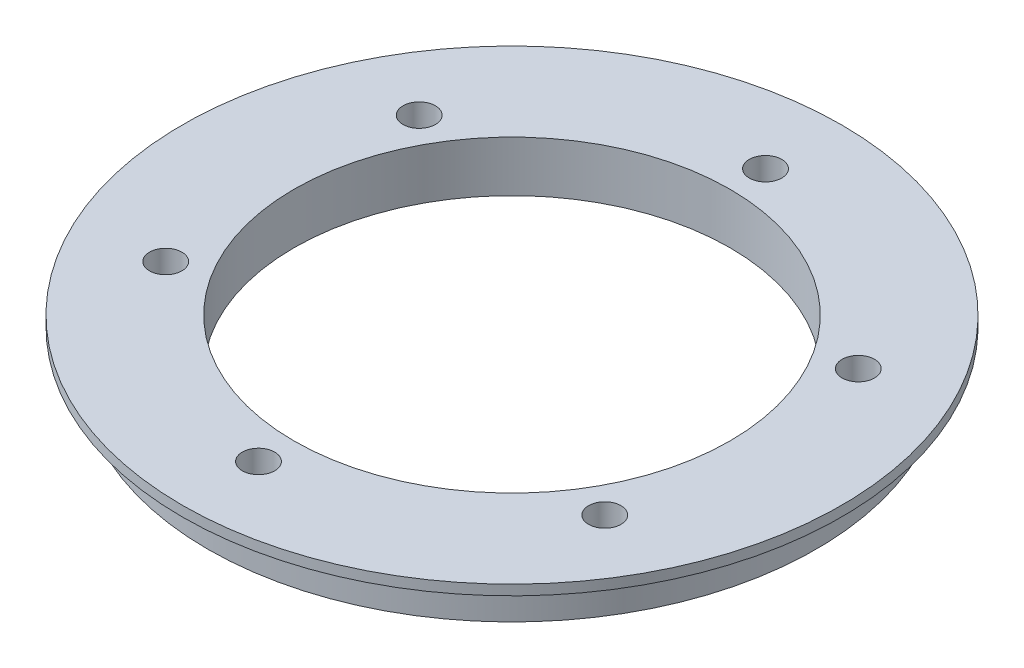
ISO-10303-21;
HEADER;
FILE_DESCRIPTION(('STEP AP214'),'2;1');
FILE_NAME('part.step','',(''),(''),'','','');
FILE_SCHEMA(('AUTOMOTIVE_DESIGN { 1 0 10303 214 1 1 1 1 }'));
ENDSEC;
DATA;
#1=APPLICATION_CONTEXT('core data for automotive mechanical design processes');
#2=APPLICATION_PROTOCOL_DEFINITION('international standard','automotive_design',2000,#1);
#3=PRODUCT_CONTEXT('',#1,'mechanical');
#4=PRODUCT('Part','Part','',(#3));
#5=PRODUCT_RELATED_PRODUCT_CATEGORY('part','',(#4));
#6=PRODUCT_DEFINITION_FORMATION('','',#4);
#7=PRODUCT_DEFINITION_CONTEXT('part definition',#1,'design');
#8=PRODUCT_DEFINITION('design','',#6,#7);
#9=PRODUCT_DEFINITION_SHAPE('','',#8);
#10=(LENGTH_UNIT() NAMED_UNIT(*) SI_UNIT(.MILLI.,.METRE.));
#11=(NAMED_UNIT(*) PLANE_ANGLE_UNIT() SI_UNIT($,.RADIAN.));
#12=(NAMED_UNIT(*) SI_UNIT($,.STERADIAN.) SOLID_ANGLE_UNIT());
#13=UNCERTAINTY_MEASURE_WITH_UNIT(LENGTH_MEASURE(1.E-05),#10,'distance_accuracy_value','');
#14=(GEOMETRIC_REPRESENTATION_CONTEXT(3) GLOBAL_UNCERTAINTY_ASSIGNED_CONTEXT((#13)) GLOBAL_UNIT_ASSIGNED_CONTEXT((#10,
#11,#12)) REPRESENTATION_CONTEXT('',''));
#15=CARTESIAN_POINT('',(0.,0.,0.));
#16=DIRECTION('',(0.,0.,1.));
#17=DIRECTION('',(1.,0.,0.));
#18=AXIS2_PLACEMENT_3D('',#15,#16,#17);
#19=CARTESIAN_POINT('',(0.,5.,0.));
#20=DIRECTION('',(0.,-1.,0.));
#21=DIRECTION('',(0.,0.,-1.));
#22=AXIS2_PLACEMENT_3D('',#19,#20,#21);
#23=CYLINDRICAL_SURFACE('',#22,30.);
#24=CARTESIAN_POINT('',(0.,0.,0.));
#25=DIRECTION('',(0.,1.,0.));
#26=DIRECTION('',(0.,0.,1.));
#27=AXIS2_PLACEMENT_3D('',#24,#25,#26);
#28=CIRCLE('',#27,30.);
#29=CARTESIAN_POINT('',(0.,0.,30.));
#30=VERTEX_POINT('',#29);
#31=EDGE_CURVE('E40',#30,#30,#28,.T.);
#32=ORIENTED_EDGE('',*,*,#31,.T.);
#33=EDGE_LOOP('',(#32));
#34=FACE_BOUND('',#33,.T.);
#35=CARTESIAN_POINT('',(0.,4.,0.));
#36=DIRECTION('',(0.,1.,0.));
#37=DIRECTION('',(0.,0.,1.));
#38=AXIS2_PLACEMENT_3D('',#35,#36,#37);
#39=CIRCLE('',#38,30.);
#40=CARTESIAN_POINT('',(0.,4.,30.));
#41=VERTEX_POINT('',#40);
#42=EDGE_CURVE('E10',#41,#41,#39,.T.);
#43=ORIENTED_EDGE('',*,*,#42,.F.);
#44=EDGE_LOOP('',(#43));
#45=FACE_BOUND('',#44,.T.);
#46=ADVANCED_FACE('F33',(#34,#45),#23,.T.);
#47=CARTESIAN_POINT('',(0.,0.,0.));
#48=DIRECTION('',(0.,1.,0.));
#49=DIRECTION('',(0.,0.,1.));
#50=AXIS2_PLACEMENT_3D('',#47,#48,#49);
#51=PLANE('',#50);
#52=CARTESIAN_POINT('',(0.,0.,-25.));
#53=DIRECTION('',(0.,1.,0.));
#54=DIRECTION('',(0.,0.,1.));
#55=AXIS2_PLACEMENT_3D('',#52,#53,#54);
#56=CIRCLE('',#55,1.6);
#57=CARTESIAN_POINT('',(0.,0.,-23.4));
#58=VERTEX_POINT('',#57);
#59=EDGE_CURVE('E55',#58,#58,#56,.T.);
#60=ORIENTED_EDGE('',*,*,#59,.T.);
#61=EDGE_LOOP('',(#60));
#62=FACE_BOUND('',#61,.T.);
#63=CARTESIAN_POINT('',(-21.6506350946108,0.,-12.5000000000003));
#64=DIRECTION('',(0.,1.,0.));
#65=DIRECTION('',(0.,0.,1.));
#66=AXIS2_PLACEMENT_3D('',#63,#64,#65);
#67=CIRCLE('',#66,1.6);
#68=CARTESIAN_POINT('',(-21.6506350946108,0.,-10.9000000000003));
#69=VERTEX_POINT('',#68);
#70=EDGE_CURVE('E58',#69,#69,#67,.T.);
#71=ORIENTED_EDGE('',*,*,#70,.T.);
#72=EDGE_LOOP('',(#71));
#73=FACE_BOUND('',#72,.T.);
#74=CARTESIAN_POINT('',(-21.6506350946111,0.,12.4999999999998));
#75=DIRECTION('',(0.,1.,0.));
#76=DIRECTION('',(0.,0.,1.));
#77=AXIS2_PLACEMENT_3D('',#74,#75,#76);
#78=CIRCLE('',#77,1.6);
#79=CARTESIAN_POINT('',(-21.6506350946111,0.,14.0999999999998));
#80=VERTEX_POINT('',#79);
#81=EDGE_CURVE('E61',#80,#80,#78,.T.);
#82=ORIENTED_EDGE('',*,*,#81,.T.);
#83=EDGE_LOOP('',(#82));
#84=FACE_BOUND('',#83,.T.);
#85=CARTESIAN_POINT('',(-1.74574066942157E-13,0.,25.));
#86=DIRECTION('',(0.,1.,0.));
#87=DIRECTION('',(0.,0.,1.));
#88=AXIS2_PLACEMENT_3D('',#85,#86,#87);
#89=CIRCLE('',#88,1.6);
#90=CARTESIAN_POINT('',(-1.74574066942157E-13,0.,26.6));
#91=VERTEX_POINT('',#90);
#92=EDGE_CURVE('E64',#91,#91,#89,.T.);
#93=ORIENTED_EDGE('',*,*,#92,.T.);
#94=EDGE_LOOP('',(#93));
#95=FACE_BOUND('',#94,.T.);
#96=CARTESIAN_POINT('',(21.6506350946109,0.,12.5000000000001));
#97=DIRECTION('',(0.,1.,0.));
#98=DIRECTION('',(0.,0.,1.));
#99=AXIS2_PLACEMENT_3D('',#96,#97,#98);
#100=CIRCLE('',#99,1.6);
#101=CARTESIAN_POINT('',(21.6506350946109,0.,14.1000000000001));
#102=VERTEX_POINT('',#101);
#103=EDGE_CURVE('E67',#102,#102,#100,.T.);
#104=ORIENTED_EDGE('',*,*,#103,.T.);
#105=EDGE_LOOP('',(#104));
#106=FACE_BOUND('',#105,.T.);
#107=CARTESIAN_POINT('',(21.650635094611,0.,-12.5));
#108=DIRECTION('',(0.,1.,0.));
#109=DIRECTION('',(0.,0.,1.));
#110=AXIS2_PLACEMENT_3D('',#107,#108,#109);
#111=CIRCLE('',#110,1.6);
#112=CARTESIAN_POINT('',(21.650635094611,0.,-10.8999999999999));
#113=VERTEX_POINT('',#112);
#114=EDGE_CURVE('E70',#113,#113,#111,.T.);
#115=ORIENTED_EDGE('',*,*,#114,.T.);
#116=EDGE_LOOP('',(#115));
#117=FACE_BOUND('',#116,.T.);
#118=CARTESIAN_POINT('',(0.,0.,0.));
#119=DIRECTION('',(0.,-1.,0.));
#120=DIRECTION('',(0.,0.,-1.));
#121=AXIS2_PLACEMENT_3D('',#118,#119,#120);
#122=CIRCLE('',#121,21.5);
#123=CARTESIAN_POINT('',(0.,0.,-21.5));
#124=VERTEX_POINT('',#123);
#125=EDGE_CURVE('E52',#124,#124,#122,.T.);
#126=ORIENTED_EDGE('',*,*,#125,.F.);
#127=EDGE_LOOP('',(#126));
#128=FACE_BOUND('',#127,.T.);
#129=ORIENTED_EDGE('',*,*,#31,.F.);
#130=EDGE_LOOP('',(#129));
#131=FACE_BOUND('',#130,.T.);
#132=ADVANCED_FACE('F118',(#62,#73,#84,#95,#106,#117,#128,#131),#51,.F.);
#133=CARTESIAN_POINT('',(0.,4.,0.));
#134=DIRECTION('',(0.,1.,0.));
#135=DIRECTION('',(0.,0.,1.));
#136=AXIS2_PLACEMENT_3D('',#133,#134,#135);
#137=CYLINDRICAL_SURFACE('',#136,32.5);
#138=CARTESIAN_POINT('',(0.,4.,0.));
#139=DIRECTION('',(0.,1.,0.));
#140=DIRECTION('',(0.,0.,1.));
#141=AXIS2_PLACEMENT_3D('',#138,#139,#140);
#142=CIRCLE('',#141,32.5);
#143=CARTESIAN_POINT('',(0.,4.,32.5));
#144=VERTEX_POINT('',#143);
#145=EDGE_CURVE('E44',#144,#144,#142,.T.);
#146=ORIENTED_EDGE('',*,*,#145,.T.);
#147=EDGE_LOOP('',(#146));
#148=FACE_BOUND('',#147,.T.);
#149=CARTESIAN_POINT('',(0.,5.,0.));
#150=DIRECTION('',(0.,1.,0.));
#151=DIRECTION('',(0.,0.,1.));
#152=AXIS2_PLACEMENT_3D('',#149,#150,#151);
#153=CIRCLE('',#152,32.5);
#154=CARTESIAN_POINT('',(0.,5.,32.5));
#155=VERTEX_POINT('',#154);
#156=EDGE_CURVE('E47',#155,#155,#153,.T.);
#157=ORIENTED_EDGE('',*,*,#156,.F.);
#158=EDGE_LOOP('',(#157));
#159=FACE_BOUND('',#158,.T.);
#160=ADVANCED_FACE('F116',(#148,#159),#137,.T.);
#161=CARTESIAN_POINT('',(0.,4.,0.));
#162=DIRECTION('',(0.,1.,0.));
#163=DIRECTION('',(0.,0.,1.));
#164=AXIS2_PLACEMENT_3D('',#161,#162,#163);
#165=PLANE('',#164);
#166=ORIENTED_EDGE('',*,*,#42,.T.);
#167=EDGE_LOOP('',(#166));
#168=FACE_BOUND('',#167,.T.);
#169=ORIENTED_EDGE('',*,*,#145,.F.);
#170=EDGE_LOOP('',(#169));
#171=FACE_BOUND('',#170,.T.);
#172=ADVANCED_FACE('F99',(#168,#171),#165,.F.);
#173=CARTESIAN_POINT('',(0.,5.,0.));
#174=DIRECTION('',(0.,1.,0.));
#175=DIRECTION('',(0.,0.,1.));
#176=AXIS2_PLACEMENT_3D('',#173,#174,#175);
#177=PLANE('',#176);
#178=CARTESIAN_POINT('',(0.,5.,-25.));
#179=DIRECTION('',(0.,1.,0.));
#180=DIRECTION('',(0.,0.,1.));
#181=AXIS2_PLACEMENT_3D('',#178,#179,#180);
#182=CIRCLE('',#181,1.6);
#183=CARTESIAN_POINT('',(0.,5.,-23.4));
#184=VERTEX_POINT('',#183);
#185=EDGE_CURVE('E73',#184,#184,#182,.T.);
#186=ORIENTED_EDGE('',*,*,#185,.F.);
#187=EDGE_LOOP('',(#186));
#188=FACE_BOUND('',#187,.T.);
#189=CARTESIAN_POINT('',(-21.6506350946108,5.,-12.5000000000003));
#190=DIRECTION('',(0.,1.,0.));
#191=DIRECTION('',(0.,0.,1.));
#192=AXIS2_PLACEMENT_3D('',#189,#190,#191);
#193=CIRCLE('',#192,1.6);
#194=CARTESIAN_POINT('',(-21.6506350946108,5.,-10.9000000000003));
#195=VERTEX_POINT('',#194);
#196=EDGE_CURVE('E78',#195,#195,#193,.T.);
#197=ORIENTED_EDGE('',*,*,#196,.F.);
#198=EDGE_LOOP('',(#197));
#199=FACE_BOUND('',#198,.T.);
#200=CARTESIAN_POINT('',(-21.6506350946111,5.,12.4999999999998));
#201=DIRECTION('',(0.,1.,0.));
#202=DIRECTION('',(0.,0.,1.));
#203=AXIS2_PLACEMENT_3D('',#200,#201,#202);
#204=CIRCLE('',#203,1.6);
#205=CARTESIAN_POINT('',(-21.6506350946111,5.,14.0999999999998));
#206=VERTEX_POINT('',#205);
#207=EDGE_CURVE('E74',#206,#206,#204,.T.);
#208=ORIENTED_EDGE('',*,*,#207,.F.);
#209=EDGE_LOOP('',(#208));
#210=FACE_BOUND('',#209,.T.);
#211=CARTESIAN_POINT('',(-1.74574066942157E-13,5.,25.));
#212=DIRECTION('',(0.,1.,0.));
#213=DIRECTION('',(0.,0.,1.));
#214=AXIS2_PLACEMENT_3D('',#211,#212,#213);
#215=CIRCLE('',#214,1.6);
#216=CARTESIAN_POINT('',(-1.74574066942157E-13,5.,26.6));
#217=VERTEX_POINT('',#216);
#218=EDGE_CURVE('E77',#217,#217,#215,.T.);
#219=ORIENTED_EDGE('',*,*,#218,.F.);
#220=EDGE_LOOP('',(#219));
#221=FACE_BOUND('',#220,.T.);
#222=CARTESIAN_POINT('',(21.6506350946109,5.,12.5000000000001));
#223=DIRECTION('',(0.,1.,0.));
#224=DIRECTION('',(0.,0.,1.));
#225=AXIS2_PLACEMENT_3D('',#222,#223,#224);
#226=CIRCLE('',#225,1.6);
#227=CARTESIAN_POINT('',(21.6506350946109,5.,14.1000000000001));
#228=VERTEX_POINT('',#227);
#229=EDGE_CURVE('E81',#228,#228,#226,.T.);
#230=ORIENTED_EDGE('',*,*,#229,.F.);
#231=EDGE_LOOP('',(#230));
#232=FACE_BOUND('',#231,.T.);
#233=CARTESIAN_POINT('',(21.650635094611,5.,-12.5));
#234=DIRECTION('',(0.,1.,0.));
#235=DIRECTION('',(0.,0.,1.));
#236=AXIS2_PLACEMENT_3D('',#233,#234,#235);
#237=CIRCLE('',#236,1.6);
#238=CARTESIAN_POINT('',(21.650635094611,5.,-10.8999999999999));
#239=VERTEX_POINT('',#238);
#240=EDGE_CURVE('E84',#239,#239,#237,.T.);
#241=ORIENTED_EDGE('',*,*,#240,.F.);
#242=EDGE_LOOP('',(#241));
#243=FACE_BOUND('',#242,.T.);
#244=CARTESIAN_POINT('',(0.,5.,0.));
#245=DIRECTION('',(0.,1.,0.));
#246=DIRECTION('',(0.,0.,1.));
#247=AXIS2_PLACEMENT_3D('',#244,#245,#246);
#248=CIRCLE('',#247,21.5);
#249=CARTESIAN_POINT('',(0.,5.,21.5));
#250=VERTEX_POINT('',#249);
#251=EDGE_CURVE('E36',#250,#250,#248,.T.);
#252=ORIENTED_EDGE('',*,*,#251,.F.);
#253=EDGE_LOOP('',(#252));
#254=FACE_BOUND('',#253,.T.);
#255=ORIENTED_EDGE('',*,*,#156,.T.);
#256=EDGE_LOOP('',(#255));
#257=FACE_BOUND('',#256,.T.);
#258=ADVANCED_FACE('F95',(#188,#199,#210,#221,#232,#243,#254,#257),#177,.T.);
#259=CARTESIAN_POINT('',(0.,25.,0.));
#260=DIRECTION('',(0.,-1.,0.));
#261=DIRECTION('',(0.,0.,-1.));
#262=AXIS2_PLACEMENT_3D('',#259,#260,#261);
#263=CYLINDRICAL_SURFACE('',#262,21.5);
#264=ORIENTED_EDGE('',*,*,#251,.T.);
#265=EDGE_LOOP('',(#264));
#266=FACE_BOUND('',#265,.T.);
#267=ORIENTED_EDGE('',*,*,#125,.T.);
#268=EDGE_LOOP('',(#267));
#269=FACE_BOUND('',#268,.T.);
#270=ADVANCED_FACE('F98',(#266,#269),#263,.F.);
#271=CARTESIAN_POINT('',(21.650635094611,-20.,-12.5));
#272=DIRECTION('',(0.,1.,0.));
#273=DIRECTION('',(0.,0.,1.));
#274=AXIS2_PLACEMENT_3D('',#271,#272,#273);
#275=CYLINDRICAL_SURFACE('',#274,1.6);
#276=ORIENTED_EDGE('',*,*,#240,.T.);
#277=EDGE_LOOP('',(#276));
#278=FACE_BOUND('',#277,.T.);
#279=ORIENTED_EDGE('',*,*,#114,.F.);
#280=EDGE_LOOP('',(#279));
#281=FACE_BOUND('',#280,.T.);
#282=ADVANCED_FACE('F156',(#278,#281),#275,.F.);
#283=CARTESIAN_POINT('',(21.6506350946109,-20.,12.5000000000001));
#284=DIRECTION('',(0.,1.,0.));
#285=DIRECTION('',(0.,0.,1.));
#286=AXIS2_PLACEMENT_3D('',#283,#284,#285);
#287=CYLINDRICAL_SURFACE('',#286,1.6);
#288=ORIENTED_EDGE('',*,*,#229,.T.);
#289=EDGE_LOOP('',(#288));
#290=FACE_BOUND('',#289,.T.);
#291=ORIENTED_EDGE('',*,*,#103,.F.);
#292=EDGE_LOOP('',(#291));
#293=FACE_BOUND('',#292,.T.);
#294=ADVANCED_FACE('F161',(#290,#293),#287,.F.);
#295=CARTESIAN_POINT('',(-1.74574066942157E-13,-20.,25.));
#296=DIRECTION('',(0.,1.,0.));
#297=DIRECTION('',(0.,0.,1.));
#298=AXIS2_PLACEMENT_3D('',#295,#296,#297);
#299=CYLINDRICAL_SURFACE('',#298,1.6);
#300=ORIENTED_EDGE('',*,*,#218,.T.);
#301=EDGE_LOOP('',(#300));
#302=FACE_BOUND('',#301,.T.);
#303=ORIENTED_EDGE('',*,*,#92,.F.);
#304=EDGE_LOOP('',(#303));
#305=FACE_BOUND('',#304,.T.);
#306=ADVANCED_FACE('F171',(#302,#305),#299,.F.);
#307=CARTESIAN_POINT('',(-21.6506350946111,-20.,12.4999999999998));
#308=DIRECTION('',(0.,1.,0.));
#309=DIRECTION('',(0.,0.,1.));
#310=AXIS2_PLACEMENT_3D('',#307,#308,#309);
#311=CYLINDRICAL_SURFACE('',#310,1.6);
#312=ORIENTED_EDGE('',*,*,#207,.T.);
#313=EDGE_LOOP('',(#312));
#314=FACE_BOUND('',#313,.T.);
#315=ORIENTED_EDGE('',*,*,#81,.F.);
#316=EDGE_LOOP('',(#315));
#317=FACE_BOUND('',#316,.T.);
#318=ADVANCED_FACE('F181',(#314,#317),#311,.F.);
#319=CARTESIAN_POINT('',(-21.6506350946108,-20.,-12.5000000000003));
#320=DIRECTION('',(0.,1.,0.));
#321=DIRECTION('',(0.,0.,1.));
#322=AXIS2_PLACEMENT_3D('',#319,#320,#321);
#323=CYLINDRICAL_SURFACE('',#322,1.6);
#324=ORIENTED_EDGE('',*,*,#196,.T.);
#325=EDGE_LOOP('',(#324));
#326=FACE_BOUND('',#325,.T.);
#327=ORIENTED_EDGE('',*,*,#70,.F.);
#328=EDGE_LOOP('',(#327));
#329=FACE_BOUND('',#328,.T.);
#330=ADVANCED_FACE('F191',(#326,#329),#323,.F.);
#331=CARTESIAN_POINT('',(0.,-20.,-25.));
#332=DIRECTION('',(0.,1.,0.));
#333=DIRECTION('',(0.,0.,1.));
#334=AXIS2_PLACEMENT_3D('',#331,#332,#333);
#335=CYLINDRICAL_SURFACE('',#334,1.6);
#336=ORIENTED_EDGE('',*,*,#185,.T.);
#337=EDGE_LOOP('',(#336));
#338=FACE_BOUND('',#337,.T.);
#339=ORIENTED_EDGE('',*,*,#59,.F.);
#340=EDGE_LOOP('',(#339));
#341=FACE_BOUND('',#340,.T.);
#342=ADVANCED_FACE('F92',(#338,#341),#335,.F.);
#343=CLOSED_SHELL('',(#46,#132,#160,#172,#258,#270,#282,#294,#306,#318,#330,#342));
#344=MANIFOLD_SOLID_BREP('B2',#343);
#345=ADVANCED_BREP_SHAPE_REPRESENTATION('',(#18,#344),#14);
#346=SHAPE_DEFINITION_REPRESENTATION(#9,#345);
ENDSEC;
END-ISO-10303-21;
